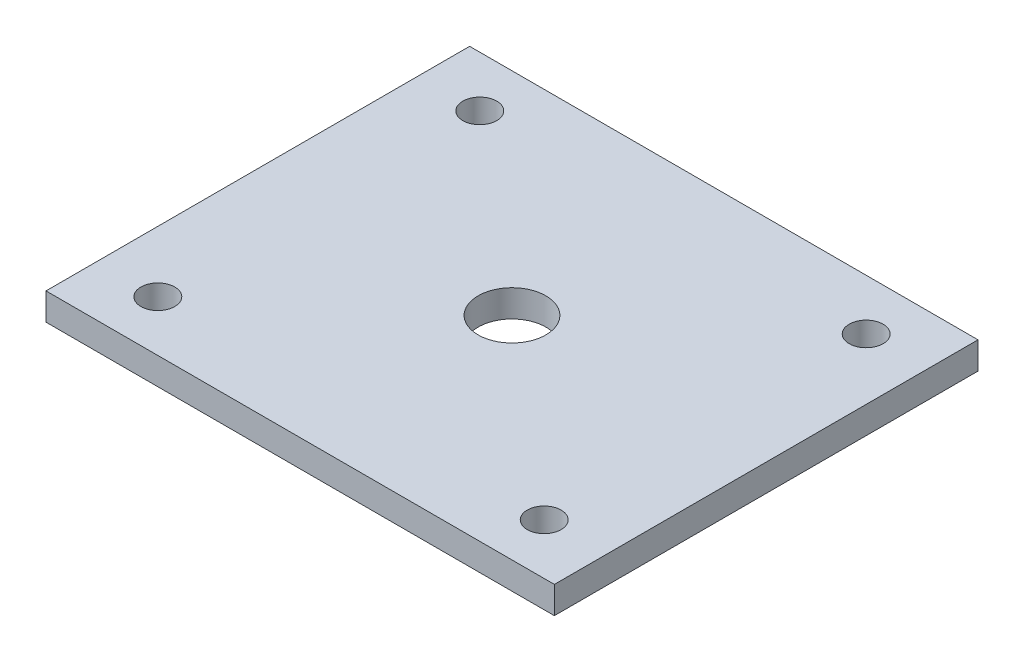
ISO-10303-21;
HEADER;
FILE_DESCRIPTION(('STEP AP214'),'2;1');
FILE_NAME('part.step','',(''),(''),'','','');
FILE_SCHEMA(('AUTOMOTIVE_DESIGN { 1 0 10303 214 1 1 1 1 }'));
ENDSEC;
DATA;
#1=APPLICATION_CONTEXT('core data for automotive mechanical design processes');
#2=APPLICATION_PROTOCOL_DEFINITION('international standard','automotive_design',2000,#1);
#3=PRODUCT_CONTEXT('',#1,'mechanical');
#4=PRODUCT('Part','Part','',(#3));
#5=PRODUCT_RELATED_PRODUCT_CATEGORY('part','',(#4));
#6=PRODUCT_DEFINITION_FORMATION('','',#4);
#7=PRODUCT_DEFINITION_CONTEXT('part definition',#1,'design');
#8=PRODUCT_DEFINITION('design','',#6,#7);
#9=PRODUCT_DEFINITION_SHAPE('','',#8);
#10=(LENGTH_UNIT() NAMED_UNIT(*) SI_UNIT(.MILLI.,.METRE.));
#11=(NAMED_UNIT(*) PLANE_ANGLE_UNIT() SI_UNIT($,.RADIAN.));
#12=(NAMED_UNIT(*) SI_UNIT($,.STERADIAN.) SOLID_ANGLE_UNIT());
#13=UNCERTAINTY_MEASURE_WITH_UNIT(LENGTH_MEASURE(1.E-05),#10,'distance_accuracy_value','');
#14=(GEOMETRIC_REPRESENTATION_CONTEXT(3) GLOBAL_UNCERTAINTY_ASSIGNED_CONTEXT((#13)) GLOBAL_UNIT_ASSIGNED_CONTEXT((#10,
#11,#12)) REPRESENTATION_CONTEXT('',''));
#15=CARTESIAN_POINT('',(0.,0.,0.));
#16=DIRECTION('',(0.,0.,1.));
#17=DIRECTION('',(1.,0.,0.));
#18=AXIS2_PLACEMENT_3D('',#15,#16,#17);
#19=CARTESIAN_POINT('',(0.,1.6,0.));
#20=DIRECTION('',(0.,1.,0.));
#21=DIRECTION('',(0.,0.,1.));
#22=AXIS2_PLACEMENT_3D('',#19,#20,#21);
#23=PLANE('',#22);
#24=CARTESIAN_POINT('',(-11.4,1.6,9.50000000000001));
#25=DIRECTION('',(0.,1.,0.));
#26=DIRECTION('',(0.,0.,-1.));
#27=AXIS2_PLACEMENT_3D('',#24,#25,#26);
#28=CIRCLE('',#27,1.00000000000001);
#29=CARTESIAN_POINT('',(-11.4,1.6,8.50000000000001));
#30=VERTEX_POINT('',#29);
#31=EDGE_CURVE('E131',#30,#30,#28,.T.);
#32=ORIENTED_EDGE('',*,*,#31,.F.);
#33=EDGE_LOOP('',(#32));
#34=FACE_BOUND('',#33,.T.);
#35=CARTESIAN_POINT('',(11.4,1.6,-9.50000000000032));
#36=DIRECTION('',(0.,1.,0.));
#37=DIRECTION('',(0.,0.,1.));
#38=AXIS2_PLACEMENT_3D('',#35,#36,#37);
#39=CIRCLE('',#38,0.999999999999998);
#40=CARTESIAN_POINT('',(11.4,1.6,-8.50000000000032));
#41=VERTEX_POINT('',#40);
#42=EDGE_CURVE('E119',#41,#41,#39,.T.);
#43=ORIENTED_EDGE('',*,*,#42,.F.);
#44=EDGE_LOOP('',(#43));
#45=FACE_BOUND('',#44,.T.);
#46=DIRECTION('',(0.,0.,-1.));
#47=VECTOR('',#46,1.);
#48=CARTESIAN_POINT('',(15.,1.6,-12.5));
#49=LINE('',#48,#47);
#50=CARTESIAN_POINT('',(15.,1.6,12.5));
#51=VERTEX_POINT('',#50);
#52=CARTESIAN_POINT('',(15.,1.6,-12.5));
#53=VERTEX_POINT('',#52);
#54=EDGE_CURVE('E89',#51,#53,#49,.T.);
#55=ORIENTED_EDGE('',*,*,#54,.T.);
#56=DIRECTION('',(-1.,0.,0.));
#57=VECTOR('',#56,1.);
#58=CARTESIAN_POINT('',(-15.,1.6,-12.5));
#59=LINE('',#58,#57);
#60=CARTESIAN_POINT('',(-15.,1.6,-12.5));
#61=VERTEX_POINT('',#60);
#62=EDGE_CURVE('E84',#53,#61,#59,.T.);
#63=ORIENTED_EDGE('',*,*,#62,.T.);
#64=DIRECTION('',(0.,0.,1.));
#65=VECTOR('',#64,1.);
#66=CARTESIAN_POINT('',(-15.,1.6,-12.5));
#67=LINE('',#66,#65);
#68=CARTESIAN_POINT('',(-15.,1.6,12.5));
#69=VERTEX_POINT('',#68);
#70=EDGE_CURVE('E87',#61,#69,#67,.T.);
#71=ORIENTED_EDGE('',*,*,#70,.T.);
#72=DIRECTION('',(1.,0.,0.));
#73=VECTOR('',#72,1.);
#74=CARTESIAN_POINT('',(-15.,1.6,12.5));
#75=LINE('',#74,#73);
#76=EDGE_CURVE('E54',#69,#51,#75,.T.);
#77=ORIENTED_EDGE('',*,*,#76,.T.);
#78=EDGE_LOOP('',(#55,#63,#71,#77));
#79=FACE_BOUND('',#78,.T.);
#80=CARTESIAN_POINT('',(-11.4,1.6,-9.5));
#81=DIRECTION('',(0.,1.,0.));
#82=DIRECTION('',(0.,0.,1.));
#83=AXIS2_PLACEMENT_3D('',#80,#81,#82);
#84=CIRCLE('',#83,1.);
#85=CARTESIAN_POINT('',(-11.4,1.6,-8.49999999999999));
#86=VERTEX_POINT('',#85);
#87=EDGE_CURVE('E104',#86,#86,#84,.T.);
#88=ORIENTED_EDGE('',*,*,#87,.F.);
#89=EDGE_LOOP('',(#88));
#90=FACE_BOUND('',#89,.T.);
#91=CARTESIAN_POINT('',(11.4,1.6,9.50000000000034));
#92=DIRECTION('',(0.,1.,0.));
#93=DIRECTION('',(0.,0.,-1.));
#94=AXIS2_PLACEMENT_3D('',#91,#92,#93);
#95=CIRCLE('',#94,0.999999999999998);
#96=CARTESIAN_POINT('',(11.4,1.6,8.50000000000034));
#97=VERTEX_POINT('',#96);
#98=EDGE_CURVE('E125',#97,#97,#95,.T.);
#99=ORIENTED_EDGE('',*,*,#98,.F.);
#100=EDGE_LOOP('',(#99));
#101=FACE_BOUND('',#100,.T.);
#102=CARTESIAN_POINT('',(0.,1.6,0.));
#103=DIRECTION('',(0.,1.,0.));
#104=DIRECTION('',(0.,0.,1.));
#105=AXIS2_PLACEMENT_3D('',#102,#103,#104);
#106=CIRCLE('',#105,2.);
#107=CARTESIAN_POINT('',(0.,1.6,2.));
#108=VERTEX_POINT('',#107);
#109=EDGE_CURVE('E137',#108,#108,#106,.T.);
#110=ORIENTED_EDGE('',*,*,#109,.F.);
#111=EDGE_LOOP('',(#110));
#112=FACE_BOUND('',#111,.T.);
#113=ADVANCED_FACE('F37',(#34,#45,#79,#90,#101,#112),#23,.T.);
#114=CARTESIAN_POINT('',(0.,0.,0.));
#115=DIRECTION('',(0.,1.,0.));
#116=DIRECTION('',(0.,0.,1.));
#117=AXIS2_PLACEMENT_3D('',#114,#115,#116);
#118=PLANE('',#117);
#119=DIRECTION('',(0.,0.,-1.));
#120=VECTOR('',#119,1.);
#121=CARTESIAN_POINT('',(15.,0.,-12.5));
#122=LINE('',#121,#120);
#123=CARTESIAN_POINT('',(15.,0.,12.5));
#124=VERTEX_POINT('',#123);
#125=CARTESIAN_POINT('',(15.,0.,-12.5));
#126=VERTEX_POINT('',#125);
#127=EDGE_CURVE('E101',#124,#126,#122,.T.);
#128=ORIENTED_EDGE('',*,*,#127,.F.);
#129=DIRECTION('',(1.,0.,0.));
#130=VECTOR('',#129,1.);
#131=CARTESIAN_POINT('',(-15.,0.,12.5));
#132=LINE('',#131,#130);
#133=CARTESIAN_POINT('',(-15.,0.,12.5));
#134=VERTEX_POINT('',#133);
#135=EDGE_CURVE('E77',#134,#124,#132,.T.);
#136=ORIENTED_EDGE('',*,*,#135,.F.);
#137=DIRECTION('',(0.,0.,1.));
#138=VECTOR('',#137,1.);
#139=CARTESIAN_POINT('',(-15.,0.,-12.5));
#140=LINE('',#139,#138);
#141=CARTESIAN_POINT('',(-15.,0.,-12.5));
#142=VERTEX_POINT('',#141);
#143=EDGE_CURVE('E71',#142,#134,#140,.T.);
#144=ORIENTED_EDGE('',*,*,#143,.F.);
#145=DIRECTION('',(-1.,0.,0.));
#146=VECTOR('',#145,1.);
#147=CARTESIAN_POINT('',(-15.,0.,-12.5));
#148=LINE('',#147,#146);
#149=EDGE_CURVE('E93',#126,#142,#148,.T.);
#150=ORIENTED_EDGE('',*,*,#149,.F.);
#151=EDGE_LOOP('',(#128,#136,#144,#150));
#152=FACE_BOUND('',#151,.T.);
#153=CARTESIAN_POINT('',(-11.4,0.,-9.5));
#154=DIRECTION('',(0.,1.,0.));
#155=DIRECTION('',(0.,0.,1.));
#156=AXIS2_PLACEMENT_3D('',#153,#154,#155);
#157=CIRCLE('',#156,1.);
#158=CARTESIAN_POINT('',(-11.4,0.,-8.49999999999999));
#159=VERTEX_POINT('',#158);
#160=EDGE_CURVE('E116',#159,#159,#157,.T.);
#161=ORIENTED_EDGE('',*,*,#160,.T.);
#162=EDGE_LOOP('',(#161));
#163=FACE_BOUND('',#162,.T.);
#164=CARTESIAN_POINT('',(11.4,0.,-9.50000000000032));
#165=DIRECTION('',(0.,1.,0.));
#166=DIRECTION('',(0.,0.,1.));
#167=AXIS2_PLACEMENT_3D('',#164,#165,#166);
#168=CIRCLE('',#167,0.999999999999998);
#169=CARTESIAN_POINT('',(11.4,0.,-8.50000000000032));
#170=VERTEX_POINT('',#169);
#171=EDGE_CURVE('E122',#170,#170,#168,.T.);
#172=ORIENTED_EDGE('',*,*,#171,.T.);
#173=EDGE_LOOP('',(#172));
#174=FACE_BOUND('',#173,.T.);
#175=CARTESIAN_POINT('',(11.4,0.,9.50000000000034));
#176=DIRECTION('',(0.,1.,0.));
#177=DIRECTION('',(0.,0.,-1.));
#178=AXIS2_PLACEMENT_3D('',#175,#176,#177);
#179=CIRCLE('',#178,0.999999999999998);
#180=CARTESIAN_POINT('',(11.4,0.,8.50000000000034));
#181=VERTEX_POINT('',#180);
#182=EDGE_CURVE('E128',#181,#181,#179,.T.);
#183=ORIENTED_EDGE('',*,*,#182,.T.);
#184=EDGE_LOOP('',(#183));
#185=FACE_BOUND('',#184,.T.);
#186=CARTESIAN_POINT('',(-11.4,0.,9.50000000000001));
#187=DIRECTION('',(0.,1.,0.));
#188=DIRECTION('',(0.,0.,-1.));
#189=AXIS2_PLACEMENT_3D('',#186,#187,#188);
#190=CIRCLE('',#189,1.00000000000001);
#191=CARTESIAN_POINT('',(-11.4,0.,8.50000000000001));
#192=VERTEX_POINT('',#191);
#193=EDGE_CURVE('E134',#192,#192,#190,.T.);
#194=ORIENTED_EDGE('',*,*,#193,.T.);
#195=EDGE_LOOP('',(#194));
#196=FACE_BOUND('',#195,.T.);
#197=CARTESIAN_POINT('',(0.,0.,0.));
#198=DIRECTION('',(0.,1.,0.));
#199=DIRECTION('',(0.,0.,1.));
#200=AXIS2_PLACEMENT_3D('',#197,#198,#199);
#201=CIRCLE('',#200,2.);
#202=CARTESIAN_POINT('',(0.,0.,2.));
#203=VERTEX_POINT('',#202);
#204=EDGE_CURVE('E140',#203,#203,#201,.T.);
#205=ORIENTED_EDGE('',*,*,#204,.T.);
#206=EDGE_LOOP('',(#205));
#207=FACE_BOUND('',#206,.T.);
#208=ADVANCED_FACE('F112',(#152,#163,#174,#185,#196,#207),#118,.F.);
#209=CARTESIAN_POINT('',(15.,1.6,-12.5));
#210=DIRECTION('',(-1.,0.,0.));
#211=DIRECTION('',(0.,0.,1.));
#212=AXIS2_PLACEMENT_3D('',#209,#210,#211);
#213=PLANE('',#212);
#214=ORIENTED_EDGE('',*,*,#127,.T.);
#215=DIRECTION('',(0.,-1.,0.));
#216=VECTOR('',#215,1.);
#217=CARTESIAN_POINT('',(15.,1.6,-12.5));
#218=LINE('',#217,#216);
#219=EDGE_CURVE('E11',#53,#126,#218,.T.);
#220=ORIENTED_EDGE('',*,*,#219,.F.);
#221=ORIENTED_EDGE('',*,*,#54,.F.);
#222=DIRECTION('',(0.,-1.,0.));
#223=VECTOR('',#222,1.);
#224=CARTESIAN_POINT('',(15.,1.6,12.5));
#225=LINE('',#224,#223);
#226=EDGE_CURVE('E97',#51,#124,#225,.T.);
#227=ORIENTED_EDGE('',*,*,#226,.T.);
#228=EDGE_LOOP('',(#214,#220,#221,#227));
#229=FACE_BOUND('',#228,.T.);
#230=ADVANCED_FACE('F39',(#229),#213,.F.);
#231=CARTESIAN_POINT('',(-15.,1.6,-12.5));
#232=DIRECTION('',(0.,0.,1.));
#233=DIRECTION('',(1.,0.,0.));
#234=AXIS2_PLACEMENT_3D('',#231,#232,#233);
#235=PLANE('',#234);
#236=ORIENTED_EDGE('',*,*,#149,.T.);
#237=DIRECTION('',(0.,-1.,0.));
#238=VECTOR('',#237,1.);
#239=CARTESIAN_POINT('',(-15.,1.6,-12.5));
#240=LINE('',#239,#238);
#241=EDGE_CURVE('E46',#61,#142,#240,.T.);
#242=ORIENTED_EDGE('',*,*,#241,.F.);
#243=ORIENTED_EDGE('',*,*,#62,.F.);
#244=ORIENTED_EDGE('',*,*,#219,.T.);
#245=EDGE_LOOP('',(#236,#242,#243,#244));
#246=FACE_BOUND('',#245,.T.);
#247=ADVANCED_FACE('F92',(#246),#235,.F.);
#248=CARTESIAN_POINT('',(-15.,1.6,-12.5));
#249=DIRECTION('',(1.,0.,0.));
#250=DIRECTION('',(0.,0.,-1.));
#251=AXIS2_PLACEMENT_3D('',#248,#249,#250);
#252=PLANE('',#251);
#253=ORIENTED_EDGE('',*,*,#143,.T.);
#254=DIRECTION('',(0.,-1.,0.));
#255=VECTOR('',#254,1.);
#256=CARTESIAN_POINT('',(-15.,1.6,12.5));
#257=LINE('',#256,#255);
#258=EDGE_CURVE('E94',#69,#134,#257,.T.);
#259=ORIENTED_EDGE('',*,*,#258,.F.);
#260=ORIENTED_EDGE('',*,*,#70,.F.);
#261=ORIENTED_EDGE('',*,*,#241,.T.);
#262=EDGE_LOOP('',(#253,#259,#260,#261));
#263=FACE_BOUND('',#262,.T.);
#264=ADVANCED_FACE('F95',(#263),#252,.F.);
#265=CARTESIAN_POINT('',(-15.,1.6,12.5));
#266=DIRECTION('',(0.,0.,-1.));
#267=DIRECTION('',(-1.,0.,0.));
#268=AXIS2_PLACEMENT_3D('',#265,#266,#267);
#269=PLANE('',#268);
#270=ORIENTED_EDGE('',*,*,#135,.T.);
#271=ORIENTED_EDGE('',*,*,#226,.F.);
#272=ORIENTED_EDGE('',*,*,#76,.F.);
#273=ORIENTED_EDGE('',*,*,#258,.T.);
#274=EDGE_LOOP('',(#270,#271,#272,#273));
#275=FACE_BOUND('',#274,.T.);
#276=ADVANCED_FACE('F109',(#275),#269,.F.);
#277=CARTESIAN_POINT('',(-11.4,1.6,-9.5));
#278=DIRECTION('',(0.,-1.,0.));
#279=DIRECTION('',(0.,0.,-1.));
#280=AXIS2_PLACEMENT_3D('',#277,#278,#279);
#281=CYLINDRICAL_SURFACE('',#280,1.);
#282=ORIENTED_EDGE('',*,*,#87,.T.);
#283=EDGE_LOOP('',(#282));
#284=FACE_BOUND('',#283,.T.);
#285=ORIENTED_EDGE('',*,*,#160,.F.);
#286=EDGE_LOOP('',(#285));
#287=FACE_BOUND('',#286,.T.);
#288=ADVANCED_FACE('F159',(#284,#287),#281,.F.);
#289=CARTESIAN_POINT('',(11.4,1.6,-9.50000000000032));
#290=DIRECTION('',(0.,-1.,0.));
#291=DIRECTION('',(0.,0.,-1.));
#292=AXIS2_PLACEMENT_3D('',#289,#290,#291);
#293=CYLINDRICAL_SURFACE('',#292,0.999999999999998);
#294=ORIENTED_EDGE('',*,*,#42,.T.);
#295=EDGE_LOOP('',(#294));
#296=FACE_BOUND('',#295,.T.);
#297=ORIENTED_EDGE('',*,*,#171,.F.);
#298=EDGE_LOOP('',(#297));
#299=FACE_BOUND('',#298,.T.);
#300=ADVANCED_FACE('F205',(#296,#299),#293,.F.);
#301=CARTESIAN_POINT('',(11.4,1.6,9.50000000000034));
#302=DIRECTION('',(0.,-1.,0.));
#303=DIRECTION('',(0.,0.,-1.));
#304=AXIS2_PLACEMENT_3D('',#301,#302,#303);
#305=CYLINDRICAL_SURFACE('',#304,0.999999999999998);
#306=ORIENTED_EDGE('',*,*,#98,.T.);
#307=EDGE_LOOP('',(#306));
#308=FACE_BOUND('',#307,.T.);
#309=ORIENTED_EDGE('',*,*,#182,.F.);
#310=EDGE_LOOP('',(#309));
#311=FACE_BOUND('',#310,.T.);
#312=ADVANCED_FACE('F213',(#308,#311),#305,.F.);
#313=CARTESIAN_POINT('',(-11.4,1.6,9.50000000000001));
#314=DIRECTION('',(0.,-1.,0.));
#315=DIRECTION('',(0.,0.,-1.));
#316=AXIS2_PLACEMENT_3D('',#313,#314,#315);
#317=CYLINDRICAL_SURFACE('',#316,1.00000000000001);
#318=ORIENTED_EDGE('',*,*,#31,.T.);
#319=EDGE_LOOP('',(#318));
#320=FACE_BOUND('',#319,.T.);
#321=ORIENTED_EDGE('',*,*,#193,.F.);
#322=EDGE_LOOP('',(#321));
#323=FACE_BOUND('',#322,.T.);
#324=ADVANCED_FACE('F221',(#320,#323),#317,.F.);
#325=CARTESIAN_POINT('',(0.,1.6,0.));
#326=DIRECTION('',(0.,-1.,0.));
#327=DIRECTION('',(0.,0.,-1.));
#328=AXIS2_PLACEMENT_3D('',#325,#326,#327);
#329=CYLINDRICAL_SURFACE('',#328,2.);
#330=ORIENTED_EDGE('',*,*,#109,.T.);
#331=EDGE_LOOP('',(#330));
#332=FACE_BOUND('',#331,.T.);
#333=ORIENTED_EDGE('',*,*,#204,.F.);
#334=EDGE_LOOP('',(#333));
#335=FACE_BOUND('',#334,.T.);
#336=ADVANCED_FACE('F146',(#332,#335),#329,.F.);
#337=CLOSED_SHELL('',(#113,#208,#230,#247,#264,#276,#288,#300,#312,#324,#336));
#338=MANIFOLD_SOLID_BREP('B2',#337);
#339=ADVANCED_BREP_SHAPE_REPRESENTATION('',(#18,#338),#14);
#340=SHAPE_DEFINITION_REPRESENTATION(#9,#339);
ENDSEC;
END-ISO-10303-21;
